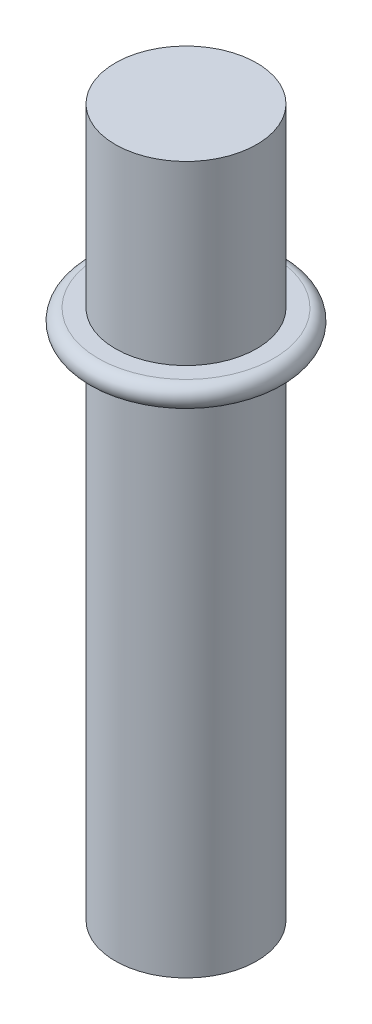
ISO-10303-21;
HEADER;
FILE_DESCRIPTION(('STEP AP214'),'2;1');
FILE_NAME('part.step','',(''),(''),'','','');
FILE_SCHEMA(('AUTOMOTIVE_DESIGN { 1 0 10303 214 1 1 1 1 }'));
ENDSEC;
DATA;
#1=APPLICATION_CONTEXT('core data for automotive mechanical design processes');
#2=APPLICATION_PROTOCOL_DEFINITION('international standard','automotive_design',2000,#1);
#3=PRODUCT_CONTEXT('',#1,'mechanical');
#4=PRODUCT('Part','Part','',(#3));
#5=PRODUCT_RELATED_PRODUCT_CATEGORY('part','',(#4));
#6=PRODUCT_DEFINITION_FORMATION('','',#4);
#7=PRODUCT_DEFINITION_CONTEXT('part definition',#1,'design');
#8=PRODUCT_DEFINITION('design','',#6,#7);
#9=PRODUCT_DEFINITION_SHAPE('','',#8);
#10=(LENGTH_UNIT() NAMED_UNIT(*) SI_UNIT(.MILLI.,.METRE.));
#11=(NAMED_UNIT(*) PLANE_ANGLE_UNIT() SI_UNIT($,.RADIAN.));
#12=(NAMED_UNIT(*) SI_UNIT($,.STERADIAN.) SOLID_ANGLE_UNIT());
#13=UNCERTAINTY_MEASURE_WITH_UNIT(LENGTH_MEASURE(1.E-05),#10,'distance_accuracy_value','');
#14=(GEOMETRIC_REPRESENTATION_CONTEXT(3) GLOBAL_UNCERTAINTY_ASSIGNED_CONTEXT((#13)) GLOBAL_UNIT_ASSIGNED_CONTEXT((#10,
#11,#12)) REPRESENTATION_CONTEXT('',''));
#15=CARTESIAN_POINT('',(0.,0.,0.));
#16=DIRECTION('',(0.,0.,1.));
#17=DIRECTION('',(1.,0.,0.));
#18=AXIS2_PLACEMENT_3D('',#15,#16,#17);
#19=CARTESIAN_POINT('',(0.,15.367,0.));
#20=DIRECTION('',(0.,1.,0.));
#21=DIRECTION('',(0.,0.,1.));
#22=AXIS2_PLACEMENT_3D('',#19,#20,#21);
#23=TOROIDAL_SURFACE('',#22,3.937,0.508000000000001);
#24=CARTESIAN_POINT('',(0.,15.875,0.));
#25=DIRECTION('',(0.,1.,0.));
#26=DIRECTION('',(0.,0.,1.));
#27=AXIS2_PLACEMENT_3D('',#24,#25,#26);
#28=CIRCLE('',#27,3.937);
#29=CARTESIAN_POINT('',(0.,15.875,3.937));
#30=VERTEX_POINT('',#29);
#31=EDGE_CURVE('E56',#30,#30,#28,.T.);
#32=ORIENTED_EDGE('',*,*,#31,.F.);
#33=EDGE_LOOP('',(#32));
#34=FACE_BOUND('',#33,.T.);
#35=CARTESIAN_POINT('',(0.,14.859,0.));
#36=DIRECTION('',(0.,1.,0.));
#37=DIRECTION('',(0.,0.,1.));
#38=AXIS2_PLACEMENT_3D('',#35,#36,#37);
#39=CIRCLE('',#38,3.937);
#40=CARTESIAN_POINT('',(0.,14.859,3.937));
#41=VERTEX_POINT('',#40);
#42=EDGE_CURVE('E11',#41,#41,#39,.F.);
#43=ORIENTED_EDGE('',*,*,#42,.F.);
#44=EDGE_LOOP('',(#43));
#45=FACE_BOUND('',#44,.T.);
#46=ADVANCED_FACE('F55',(#34,#45),#23,.T.);
#47=CARTESIAN_POINT('',(0.,15.875,0.));
#48=DIRECTION('',(0.,1.,0.));
#49=DIRECTION('',(0.,0.,1.));
#50=AXIS2_PLACEMENT_3D('',#47,#48,#49);
#51=PLANE('',#50);
#52=CARTESIAN_POINT('',(0.,15.875,0.));
#53=DIRECTION('',(0.,1.,0.));
#54=DIRECTION('',(0.,0.,1.));
#55=AXIS2_PLACEMENT_3D('',#52,#53,#54);
#56=CIRCLE('',#55,3.175);
#57=CARTESIAN_POINT('',(0.,15.875,3.175));
#58=VERTEX_POINT('',#57);
#59=EDGE_CURVE('E70',#58,#58,#56,.T.);
#60=ORIENTED_EDGE('',*,*,#59,.F.);
#61=EDGE_LOOP('',(#60));
#62=FACE_BOUND('',#61,.T.);
#63=ORIENTED_EDGE('',*,*,#31,.T.);
#64=EDGE_LOOP('',(#63));
#65=FACE_BOUND('',#64,.T.);
#66=ADVANCED_FACE('F73',(#62,#65),#51,.T.);
#67=CARTESIAN_POINT('',(0.,14.859,0.));
#68=DIRECTION('',(0.,1.,0.));
#69=DIRECTION('',(0.,0.,1.));
#70=AXIS2_PLACEMENT_3D('',#67,#68,#69);
#71=PLANE('',#70);
#72=ORIENTED_EDGE('',*,*,#42,.T.);
#73=EDGE_LOOP('',(#72));
#74=FACE_BOUND('',#73,.T.);
#75=ADVANCED_FACE('F80',(#74),#71,.F.);
#76=CARTESIAN_POINT('',(0.,23.8125,0.));
#77=DIRECTION('',(0.,-1.,0.));
#78=DIRECTION('',(0.,0.,-1.));
#79=AXIS2_PLACEMENT_3D('',#76,#77,#78);
#80=CYLINDRICAL_SURFACE('',#79,3.175);
#81=CARTESIAN_POINT('',(0.,23.8125,0.));
#82=DIRECTION('',(0.,1.,0.));
#83=DIRECTION('',(0.,0.,1.));
#84=AXIS2_PLACEMENT_3D('',#81,#82,#83);
#85=CIRCLE('',#84,3.175);
#86=CARTESIAN_POINT('',(0.,23.8125,3.175));
#87=VERTEX_POINT('',#86);
#88=EDGE_CURVE('E62',#87,#87,#85,.T.);
#89=ORIENTED_EDGE('',*,*,#88,.F.);
#90=EDGE_LOOP('',(#89));
#91=FACE_BOUND('',#90,.T.);
#92=ORIENTED_EDGE('',*,*,#59,.T.);
#93=EDGE_LOOP('',(#92));
#94=FACE_BOUND('',#93,.T.);
#95=ADVANCED_FACE('F71',(#91,#94),#80,.T.);
#96=CARTESIAN_POINT('',(0.,23.8125,0.));
#97=DIRECTION('',(0.,1.,0.));
#98=DIRECTION('',(0.,0.,1.));
#99=AXIS2_PLACEMENT_3D('',#96,#97,#98);
#100=PLANE('',#99);
#101=ORIENTED_EDGE('',*,*,#88,.T.);
#102=EDGE_LOOP('',(#101));
#103=FACE_BOUND('',#102,.T.);
#104=ADVANCED_FACE('F87',(#103),#100,.T.);
#105=CLOSED_SHELL('',(#46,#66,#75,#95,#104));
#106=MANIFOLD_SOLID_BREP('B2',#105);
#107=CARTESIAN_POINT('',(0.,14.859,0.));
#108=DIRECTION('',(0.,-1.,0.));
#109=DIRECTION('',(0.,0.,-1.));
#110=AXIS2_PLACEMENT_3D('',#107,#108,#109);
#111=CYLINDRICAL_SURFACE('',#110,3.175);
#112=CARTESIAN_POINT('',(0.,14.859,0.));
#113=DIRECTION('',(0.,1.,0.));
#114=DIRECTION('',(0.,0.,1.));
#115=AXIS2_PLACEMENT_3D('',#112,#113,#114);
#116=CIRCLE('',#115,3.175);
#117=CARTESIAN_POINT('',(0.,14.859,3.175));
#118=VERTEX_POINT('',#117);
#119=EDGE_CURVE('E51',#118,#118,#116,.T.);
#120=ORIENTED_EDGE('',*,*,#119,.F.);
#121=EDGE_LOOP('',(#120));
#122=FACE_BOUND('',#121,.T.);
#123=CARTESIAN_POINT('',(0.,-7.9375,0.));
#124=DIRECTION('',(0.,-1.,0.));
#125=DIRECTION('',(0.,0.,-1.));
#126=AXIS2_PLACEMENT_3D('',#123,#124,#125);
#127=CIRCLE('',#126,3.175);
#128=CARTESIAN_POINT('',(0.,-7.9375,-3.175));
#129=VERTEX_POINT('',#128);
#130=EDGE_CURVE('E131',#129,#129,#127,.T.);
#131=ORIENTED_EDGE('',*,*,#130,.F.);
#132=EDGE_LOOP('',(#131));
#133=FACE_BOUND('',#132,.T.);
#134=ADVANCED_FACE('F121',(#122,#133),#111,.T.);
#135=CARTESIAN_POINT('',(0.,14.859,0.));
#136=DIRECTION('',(0.,1.,0.));
#137=DIRECTION('',(0.,0.,1.));
#138=AXIS2_PLACEMENT_3D('',#135,#136,#137);
#139=PLANE('',#138);
#140=ORIENTED_EDGE('',*,*,#119,.T.);
#141=EDGE_LOOP('',(#140));
#142=FACE_BOUND('',#141,.T.);
#143=ADVANCED_FACE('F143',(#142),#139,.T.);
#144=CARTESIAN_POINT('',(0.,-7.9375,0.));
#145=DIRECTION('',(0.,-1.,0.));
#146=DIRECTION('',(0.,0.,-1.));
#147=AXIS2_PLACEMENT_3D('',#144,#145,#146);
#148=PLANE('',#147);
#149=ORIENTED_EDGE('',*,*,#130,.T.);
#150=EDGE_LOOP('',(#149));
#151=FACE_BOUND('',#150,.T.);
#152=ADVANCED_FACE('F139',(#151),#148,.T.);
#153=CLOSED_SHELL('',(#134,#143,#152));
#154=MANIFOLD_SOLID_BREP('B6',#153);
#155=ADVANCED_BREP_SHAPE_REPRESENTATION('',(#18,#106,#154),#14);
#156=SHAPE_DEFINITION_REPRESENTATION(#9,#155);
ENDSEC;
END-ISO-10303-21;
